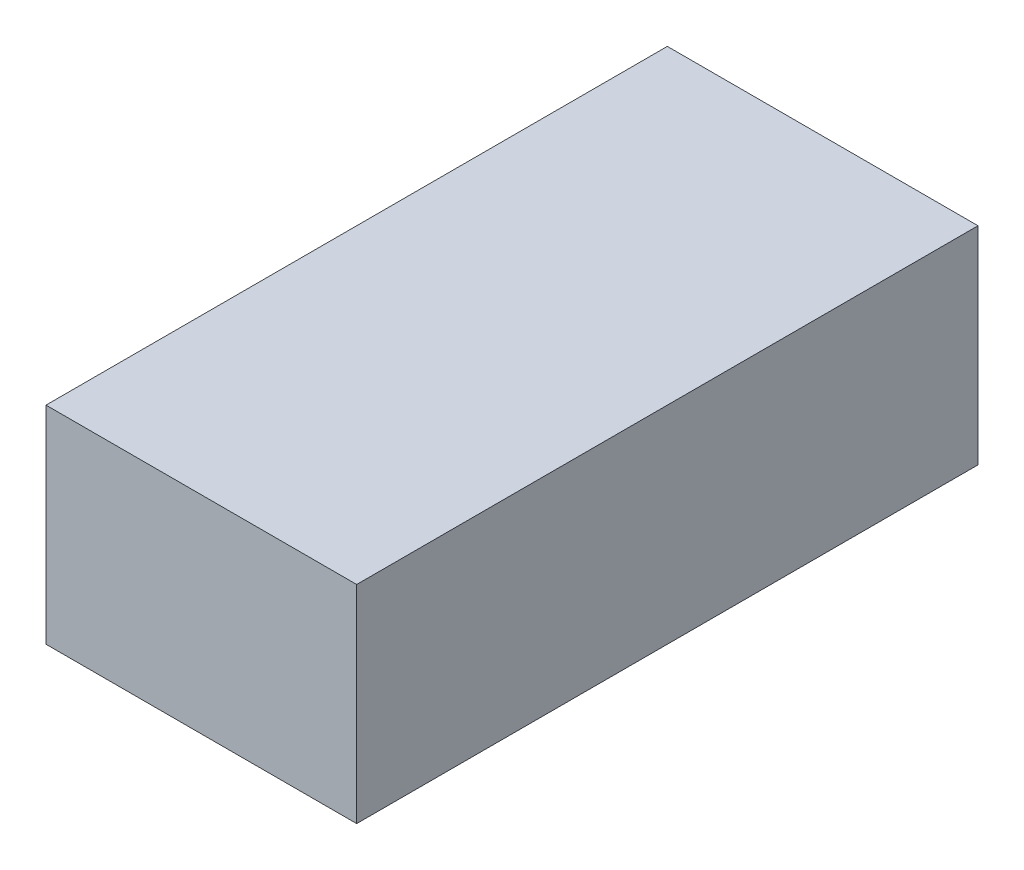
ISO-10303-21;
HEADER;
FILE_DESCRIPTION(('STEP AP214'),'2;1');
FILE_NAME('part.step','',(''),(''),'','','');
FILE_SCHEMA(('AUTOMOTIVE_DESIGN { 1 0 10303 214 1 1 1 1 }'));
ENDSEC;
DATA;
#1=APPLICATION_CONTEXT('core data for automotive mechanical design processes');
#2=APPLICATION_PROTOCOL_DEFINITION('international standard','automotive_design',2000,#1);
#3=PRODUCT_CONTEXT('',#1,'mechanical');
#4=PRODUCT('Part','Part','',(#3));
#5=PRODUCT_RELATED_PRODUCT_CATEGORY('part','',(#4));
#6=PRODUCT_DEFINITION_FORMATION('','',#4);
#7=PRODUCT_DEFINITION_CONTEXT('part definition',#1,'design');
#8=PRODUCT_DEFINITION('design','',#6,#7);
#9=PRODUCT_DEFINITION_SHAPE('','',#8);
#10=(LENGTH_UNIT() NAMED_UNIT(*) SI_UNIT(.MILLI.,.METRE.));
#11=(NAMED_UNIT(*) PLANE_ANGLE_UNIT() SI_UNIT($,.RADIAN.));
#12=(NAMED_UNIT(*) SI_UNIT($,.STERADIAN.) SOLID_ANGLE_UNIT());
#13=UNCERTAINTY_MEASURE_WITH_UNIT(LENGTH_MEASURE(1.E-05),#10,'distance_accuracy_value','');
#14=(GEOMETRIC_REPRESENTATION_CONTEXT(3) GLOBAL_UNCERTAINTY_ASSIGNED_CONTEXT((#13)) GLOBAL_UNIT_ASSIGNED_CONTEXT((#10,
#11,#12)) REPRESENTATION_CONTEXT('',''));
#15=CARTESIAN_POINT('',(0.,0.,0.));
#16=DIRECTION('',(0.,0.,1.));
#17=DIRECTION('',(1.,0.,0.));
#18=AXIS2_PLACEMENT_3D('',#15,#16,#17);
#19=CARTESIAN_POINT('',(5.,14.8760330578512,60.));
#20=DIRECTION('',(-1.,0.,0.));
#21=DIRECTION('',(0.,-1.,0.));
#22=AXIS2_PLACEMENT_3D('',#19,#20,#21);
#23=PLANE('',#22);
#24=DIRECTION('',(0.,1.,0.));
#25=VECTOR('',#24,1.);
#26=CARTESIAN_POINT('',(5.,14.8760330578512,0.));
#27=LINE('',#26,#25);
#28=CARTESIAN_POINT('',(5.,-5.12396694214876,0.));
#29=VERTEX_POINT('',#28);
#30=CARTESIAN_POINT('',(5.,14.8760330578512,0.));
#31=VERTEX_POINT('',#30);
#32=EDGE_CURVE('E106',#29,#31,#27,.T.);
#33=ORIENTED_EDGE('',*,*,#32,.T.);
#34=DIRECTION('',(0.,0.,-1.));
#35=VECTOR('',#34,1.);
#36=CARTESIAN_POINT('',(5.,14.8760330578512,60.));
#37=LINE('',#36,#35);
#38=CARTESIAN_POINT('',(5.,14.8760330578512,60.));
#39=VERTEX_POINT('',#38);
#40=EDGE_CURVE('E11',#39,#31,#37,.T.);
#41=ORIENTED_EDGE('',*,*,#40,.F.);
#42=DIRECTION('',(0.,1.,0.));
#43=VECTOR('',#42,1.);
#44=CARTESIAN_POINT('',(5.,14.8760330578512,60.));
#45=LINE('',#44,#43);
#46=CARTESIAN_POINT('',(5.,-5.12396694214876,60.));
#47=VERTEX_POINT('',#46);
#48=EDGE_CURVE('E94',#47,#39,#45,.T.);
#49=ORIENTED_EDGE('',*,*,#48,.F.);
#50=DIRECTION('',(0.,0.,-1.));
#51=VECTOR('',#50,1.);
#52=CARTESIAN_POINT('',(5.,-5.12396694214876,60.));
#53=LINE('',#52,#51);
#54=EDGE_CURVE('E102',#47,#29,#53,.T.);
#55=ORIENTED_EDGE('',*,*,#54,.T.);
#56=EDGE_LOOP('',(#33,#41,#49,#55));
#57=FACE_BOUND('',#56,.T.);
#58=ADVANCED_FACE('F43',(#57),#23,.F.);
#59=CARTESIAN_POINT('',(-25.,14.8760330578512,60.));
#60=DIRECTION('',(0.,-1.,0.));
#61=DIRECTION('',(0.,0.,-1.));
#62=AXIS2_PLACEMENT_3D('',#59,#60,#61);
#63=PLANE('',#62);
#64=DIRECTION('',(-1.,0.,0.));
#65=VECTOR('',#64,1.);
#66=CARTESIAN_POINT('',(-25.,14.8760330578512,0.));
#67=LINE('',#66,#65);
#68=CARTESIAN_POINT('',(-25.,14.8760330578512,0.));
#69=VERTEX_POINT('',#68);
#70=EDGE_CURVE('E98',#31,#69,#67,.T.);
#71=ORIENTED_EDGE('',*,*,#70,.T.);
#72=DIRECTION('',(0.,0.,-1.));
#73=VECTOR('',#72,1.);
#74=CARTESIAN_POINT('',(-25.,14.8760330578512,60.));
#75=LINE('',#74,#73);
#76=CARTESIAN_POINT('',(-25.,14.8760330578512,60.));
#77=VERTEX_POINT('',#76);
#78=EDGE_CURVE('E51',#77,#69,#75,.T.);
#79=ORIENTED_EDGE('',*,*,#78,.F.);
#80=DIRECTION('',(-1.,0.,0.));
#81=VECTOR('',#80,1.);
#82=CARTESIAN_POINT('',(-25.,14.8760330578512,60.));
#83=LINE('',#82,#81);
#84=EDGE_CURVE('E89',#39,#77,#83,.T.);
#85=ORIENTED_EDGE('',*,*,#84,.F.);
#86=ORIENTED_EDGE('',*,*,#40,.T.);
#87=EDGE_LOOP('',(#71,#79,#85,#86));
#88=FACE_BOUND('',#87,.T.);
#89=ADVANCED_FACE('F97',(#88),#63,.F.);
#90=CARTESIAN_POINT('',(-25.,14.8760330578512,60.));
#91=DIRECTION('',(1.,0.,0.));
#92=DIRECTION('',(0.,1.,0.));
#93=AXIS2_PLACEMENT_3D('',#90,#91,#92);
#94=PLANE('',#93);
#95=DIRECTION('',(0.,-1.,0.));
#96=VECTOR('',#95,1.);
#97=CARTESIAN_POINT('',(-25.,14.8760330578512,0.));
#98=LINE('',#97,#96);
#99=CARTESIAN_POINT('',(-25.,-5.12396694214876,0.));
#100=VERTEX_POINT('',#99);
#101=EDGE_CURVE('E76',#69,#100,#98,.T.);
#102=ORIENTED_EDGE('',*,*,#101,.T.);
#103=DIRECTION('',(0.,0.,-1.));
#104=VECTOR('',#103,1.);
#105=CARTESIAN_POINT('',(-25.,-5.12396694214876,60.));
#106=LINE('',#105,#104);
#107=CARTESIAN_POINT('',(-25.,-5.12396694214876,60.));
#108=VERTEX_POINT('',#107);
#109=EDGE_CURVE('E99',#108,#100,#106,.T.);
#110=ORIENTED_EDGE('',*,*,#109,.F.);
#111=DIRECTION('',(0.,-1.,0.));
#112=VECTOR('',#111,1.);
#113=CARTESIAN_POINT('',(-25.,14.8760330578512,60.));
#114=LINE('',#113,#112);
#115=EDGE_CURVE('E92',#77,#108,#114,.T.);
#116=ORIENTED_EDGE('',*,*,#115,.F.);
#117=ORIENTED_EDGE('',*,*,#78,.T.);
#118=EDGE_LOOP('',(#102,#110,#116,#117));
#119=FACE_BOUND('',#118,.T.);
#120=ADVANCED_FACE('F100',(#119),#94,.F.);
#121=CARTESIAN_POINT('',(-25.,-5.12396694214876,60.));
#122=DIRECTION('',(0.,1.,0.));
#123=DIRECTION('',(0.,0.,1.));
#124=AXIS2_PLACEMENT_3D('',#121,#122,#123);
#125=PLANE('',#124);
#126=DIRECTION('',(1.,0.,0.));
#127=VECTOR('',#126,1.);
#128=CARTESIAN_POINT('',(-25.,-5.12396694214876,0.));
#129=LINE('',#128,#127);
#130=EDGE_CURVE('E82',#100,#29,#129,.T.);
#131=ORIENTED_EDGE('',*,*,#130,.T.);
#132=ORIENTED_EDGE('',*,*,#54,.F.);
#133=DIRECTION('',(1.,0.,0.));
#134=VECTOR('',#133,1.);
#135=CARTESIAN_POINT('',(-25.,-5.12396694214876,60.));
#136=LINE('',#135,#134);
#137=EDGE_CURVE('E59',#108,#47,#136,.T.);
#138=ORIENTED_EDGE('',*,*,#137,.F.);
#139=ORIENTED_EDGE('',*,*,#109,.T.);
#140=EDGE_LOOP('',(#131,#132,#138,#139));
#141=FACE_BOUND('',#140,.T.);
#142=ADVANCED_FACE('F113',(#141),#125,.F.);
#143=CARTESIAN_POINT('',(0.,0.,60.));
#144=DIRECTION('',(0.,0.,1.));
#145=DIRECTION('',(1.,0.,0.));
#146=AXIS2_PLACEMENT_3D('',#143,#144,#145);
#147=PLANE('',#146);
#148=ORIENTED_EDGE('',*,*,#48,.T.);
#149=ORIENTED_EDGE('',*,*,#84,.T.);
#150=ORIENTED_EDGE('',*,*,#115,.T.);
#151=ORIENTED_EDGE('',*,*,#137,.T.);
#152=EDGE_LOOP('',(#148,#149,#150,#151));
#153=FACE_BOUND('',#152,.T.);
#154=ADVANCED_FACE('F90',(#153),#147,.T.);
#155=CARTESIAN_POINT('',(0.,0.,0.));
#156=DIRECTION('',(0.,0.,1.));
#157=DIRECTION('',(1.,0.,0.));
#158=AXIS2_PLACEMENT_3D('',#155,#156,#157);
#159=PLANE('',#158);
#160=ORIENTED_EDGE('',*,*,#32,.F.);
#161=ORIENTED_EDGE('',*,*,#130,.F.);
#162=ORIENTED_EDGE('',*,*,#101,.F.);
#163=ORIENTED_EDGE('',*,*,#70,.F.);
#164=EDGE_LOOP('',(#160,#161,#162,#163));
#165=FACE_BOUND('',#164,.T.);
#166=ADVANCED_FACE('F116',(#165),#159,.F.);
#167=CLOSED_SHELL('',(#58,#89,#120,#142,#154,#166));
#168=MANIFOLD_SOLID_BREP('B2',#167);
#169=ADVANCED_BREP_SHAPE_REPRESENTATION('',(#18,#168),#14);
#170=SHAPE_DEFINITION_REPRESENTATION(#9,#169);
ENDSEC;
END-ISO-10303-21;
